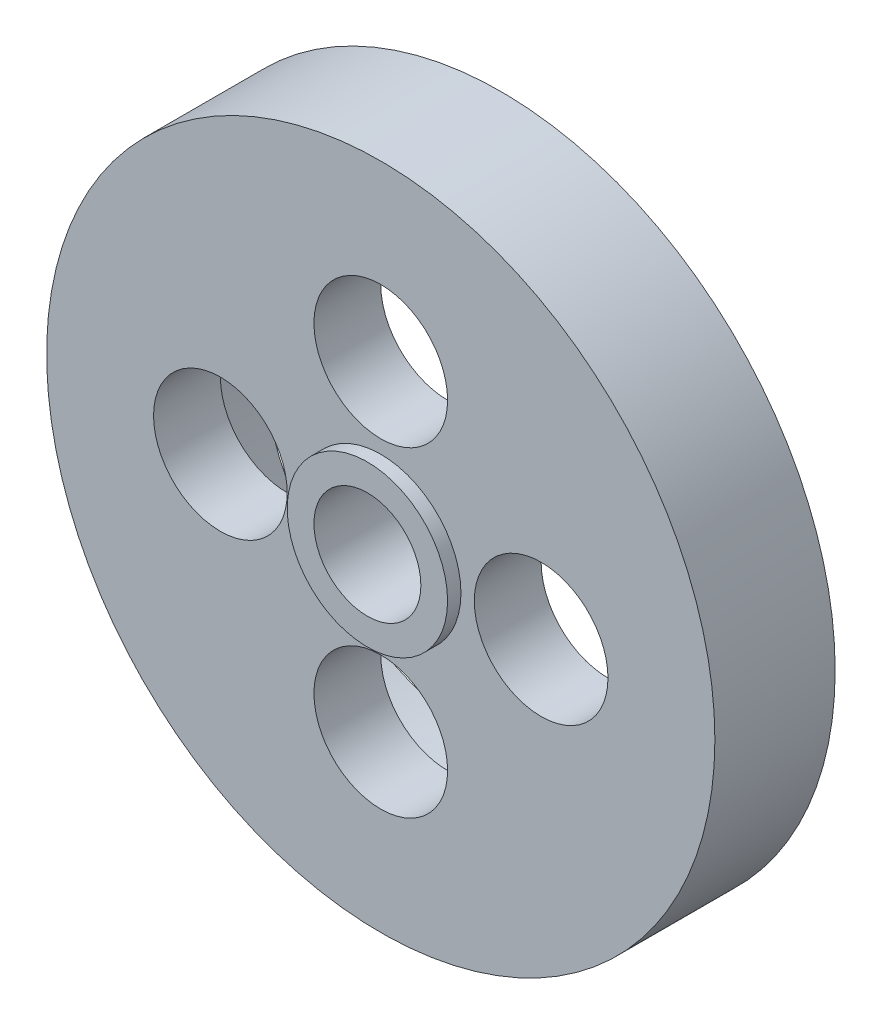
ISO-10303-21;
HEADER;
FILE_DESCRIPTION(('STEP AP214'),'2;1');
FILE_NAME('part.step','',(''),(''),'','','');
FILE_SCHEMA(('AUTOMOTIVE_DESIGN { 1 0 10303 214 1 1 1 1 }'));
ENDSEC;
DATA;
#1=APPLICATION_CONTEXT('core data for automotive mechanical design processes');
#2=APPLICATION_PROTOCOL_DEFINITION('international standard','automotive_design',2000,#1);
#3=PRODUCT_CONTEXT('',#1,'mechanical');
#4=PRODUCT('Part','Part','',(#3));
#5=PRODUCT_RELATED_PRODUCT_CATEGORY('part','',(#4));
#6=PRODUCT_DEFINITION_FORMATION('','',#4);
#7=PRODUCT_DEFINITION_CONTEXT('part definition',#1,'design');
#8=PRODUCT_DEFINITION('design','',#6,#7);
#9=PRODUCT_DEFINITION_SHAPE('','',#8);
#10=(LENGTH_UNIT() NAMED_UNIT(*) SI_UNIT(.MILLI.,.METRE.));
#11=(NAMED_UNIT(*) PLANE_ANGLE_UNIT() SI_UNIT($,.RADIAN.));
#12=(NAMED_UNIT(*) SI_UNIT($,.STERADIAN.) SOLID_ANGLE_UNIT());
#13=UNCERTAINTY_MEASURE_WITH_UNIT(LENGTH_MEASURE(1.E-05),#10,'distance_accuracy_value','');
#14=(GEOMETRIC_REPRESENTATION_CONTEXT(3) GLOBAL_UNCERTAINTY_ASSIGNED_CONTEXT((#13)) GLOBAL_UNIT_ASSIGNED_CONTEXT((#10,
#11,#12)) REPRESENTATION_CONTEXT('',''));
#15=CARTESIAN_POINT('',(0.,0.,0.));
#16=DIRECTION('',(0.,0.,1.));
#17=DIRECTION('',(1.,0.,0.));
#18=AXIS2_PLACEMENT_3D('',#15,#16,#17);
#19=CARTESIAN_POINT('',(0.,0.,9.));
#20=DIRECTION('',(0.,0.,1.));
#21=DIRECTION('',(1.,0.,0.));
#22=AXIS2_PLACEMENT_3D('',#19,#20,#21);
#23=PLANE('',#22);
#24=CARTESIAN_POINT('',(0.,0.,9.));
#25=DIRECTION('',(0.,0.,1.));
#26=DIRECTION('',(1.,0.,0.));
#27=AXIS2_PLACEMENT_3D('',#24,#25,#26);
#28=CIRCLE('',#27,25.);
#29=CARTESIAN_POINT('',(25.,0.,9.));
#30=VERTEX_POINT('',#29);
#31=EDGE_CURVE('E10',#30,#30,#28,.T.);
#32=ORIENTED_EDGE('',*,*,#31,.T.);
#33=EDGE_LOOP('',(#32));
#34=FACE_BOUND('',#33,.T.);
#35=CARTESIAN_POINT('',(12.,1.25693328198353E-13,9.));
#36=DIRECTION('',(0.,0.,1.));
#37=DIRECTION('',(1.,0.,0.));
#38=AXIS2_PLACEMENT_3D('',#35,#36,#37);
#39=CIRCLE('',#38,5.);
#40=CARTESIAN_POINT('',(17.,1.25693328198353E-13,9.));
#41=VERTEX_POINT('',#40);
#42=EDGE_CURVE('E60',#41,#41,#39,.F.);
#43=ORIENTED_EDGE('',*,*,#42,.T.);
#44=EDGE_LOOP('',(#43));
#45=FACE_BOUND('',#44,.T.);
#46=CARTESIAN_POINT('',(0.,-12.,9.));
#47=DIRECTION('',(0.,0.,1.));
#48=DIRECTION('',(1.,0.,0.));
#49=AXIS2_PLACEMENT_3D('',#46,#47,#48);
#50=CIRCLE('',#49,5.);
#51=CARTESIAN_POINT('',(5.00000000000008,-12.,9.));
#52=VERTEX_POINT('',#51);
#53=EDGE_CURVE('E64',#52,#52,#50,.F.);
#54=ORIENTED_EDGE('',*,*,#53,.T.);
#55=EDGE_LOOP('',(#54));
#56=FACE_BOUND('',#55,.T.);
#57=CARTESIAN_POINT('',(-12.,0.,9.));
#58=DIRECTION('',(0.,0.,1.));
#59=DIRECTION('',(1.,0.,0.));
#60=AXIS2_PLACEMENT_3D('',#57,#58,#59);
#61=CIRCLE('',#60,5.);
#62=CARTESIAN_POINT('',(-7.,0.,9.));
#63=VERTEX_POINT('',#62);
#64=EDGE_CURVE('E69',#63,#63,#61,.F.);
#65=ORIENTED_EDGE('',*,*,#64,.T.);
#66=EDGE_LOOP('',(#65));
#67=FACE_BOUND('',#66,.T.);
#68=CARTESIAN_POINT('',(0.,12.,9.));
#69=DIRECTION('',(0.,0.,1.));
#70=DIRECTION('',(1.,0.,0.));
#71=AXIS2_PLACEMENT_3D('',#68,#69,#70);
#72=CIRCLE('',#71,5.);
#73=CARTESIAN_POINT('',(5.,12.,9.));
#74=VERTEX_POINT('',#73);
#75=EDGE_CURVE('E58',#74,#74,#72,.F.);
#76=ORIENTED_EDGE('',*,*,#75,.T.);
#77=EDGE_LOOP('',(#76));
#78=FACE_BOUND('',#77,.T.);
#79=CARTESIAN_POINT('',(0.,0.,9.));
#80=DIRECTION('',(0.,0.,1.));
#81=DIRECTION('',(1.,0.,0.));
#82=AXIS2_PLACEMENT_3D('',#79,#80,#81);
#83=CIRCLE('',#82,6.);
#84=CARTESIAN_POINT('',(6.,0.,9.));
#85=VERTEX_POINT('',#84);
#86=EDGE_CURVE('E100',#85,#85,#83,.T.);
#87=ORIENTED_EDGE('',*,*,#86,.F.);
#88=EDGE_LOOP('',(#87));
#89=FACE_BOUND('',#88,.T.);
#90=ADVANCED_FACE('F43',(#34,#45,#56,#67,#78,#89),#23,.T.);
#91=CARTESIAN_POINT('',(12.,1.25693328198353E-13,9.001));
#92=DIRECTION('',(0.,0.,-1.));
#93=DIRECTION('',(-1.,0.,0.));
#94=AXIS2_PLACEMENT_3D('',#91,#92,#93);
#95=CYLINDRICAL_SURFACE('',#94,5.);
#96=ORIENTED_EDGE('',*,*,#42,.F.);
#97=EDGE_LOOP('',(#96));
#98=FACE_BOUND('',#97,.T.);
#99=CARTESIAN_POINT('',(12.,1.25693328198353E-13,4.));
#100=DIRECTION('',(0.,0.,-1.));
#101=DIRECTION('',(-1.,0.,0.));
#102=AXIS2_PLACEMENT_3D('',#99,#100,#101);
#103=CIRCLE('',#102,5.);
#104=CARTESIAN_POINT('',(7.,1.25693328198353E-13,4.));
#105=VERTEX_POINT('',#104);
#106=EDGE_CURVE('E65',#105,#105,#103,.F.);
#107=ORIENTED_EDGE('',*,*,#106,.F.);
#108=EDGE_LOOP('',(#107));
#109=FACE_BOUND('',#108,.T.);
#110=ADVANCED_FACE('F130',(#98,#109),#95,.F.);
#111=CARTESIAN_POINT('',(0.,-12.,9.001));
#112=DIRECTION('',(0.,0.,-1.));
#113=DIRECTION('',(-1.,0.,0.));
#114=AXIS2_PLACEMENT_3D('',#111,#112,#113);
#115=CYLINDRICAL_SURFACE('',#114,5.);
#116=ORIENTED_EDGE('',*,*,#53,.F.);
#117=EDGE_LOOP('',(#116));
#118=FACE_BOUND('',#117,.T.);
#119=CARTESIAN_POINT('',(0.,-12.,4.));
#120=DIRECTION('',(0.,0.,-1.));
#121=DIRECTION('',(-1.,0.,0.));
#122=AXIS2_PLACEMENT_3D('',#119,#120,#121);
#123=CIRCLE('',#122,5.);
#124=CARTESIAN_POINT('',(-4.99999999999992,-12.,4.));
#125=VERTEX_POINT('',#124);
#126=EDGE_CURVE('E79',#125,#125,#123,.F.);
#127=ORIENTED_EDGE('',*,*,#126,.F.);
#128=EDGE_LOOP('',(#127));
#129=FACE_BOUND('',#128,.T.);
#130=ADVANCED_FACE('F135',(#118,#129),#115,.F.);
#131=CARTESIAN_POINT('',(-12.,0.,9.001));
#132=DIRECTION('',(0.,0.,-1.));
#133=DIRECTION('',(-1.,0.,0.));
#134=AXIS2_PLACEMENT_3D('',#131,#132,#133);
#135=CYLINDRICAL_SURFACE('',#134,5.);
#136=ORIENTED_EDGE('',*,*,#64,.F.);
#137=EDGE_LOOP('',(#136));
#138=FACE_BOUND('',#137,.T.);
#139=CARTESIAN_POINT('',(-12.,0.,4.));
#140=DIRECTION('',(0.,0.,-1.));
#141=DIRECTION('',(-1.,0.,0.));
#142=AXIS2_PLACEMENT_3D('',#139,#140,#141);
#143=CIRCLE('',#142,5.);
#144=CARTESIAN_POINT('',(-17.,0.,4.));
#145=VERTEX_POINT('',#144);
#146=EDGE_CURVE('E83',#145,#145,#143,.F.);
#147=ORIENTED_EDGE('',*,*,#146,.F.);
#148=EDGE_LOOP('',(#147));
#149=FACE_BOUND('',#148,.T.);
#150=ADVANCED_FACE('F164',(#138,#149),#135,.F.);
#151=CARTESIAN_POINT('',(0.,12.,9.001));
#152=DIRECTION('',(0.,0.,-1.));
#153=DIRECTION('',(-1.,0.,0.));
#154=AXIS2_PLACEMENT_3D('',#151,#152,#153);
#155=CYLINDRICAL_SURFACE('',#154,5.);
#156=ORIENTED_EDGE('',*,*,#75,.F.);
#157=EDGE_LOOP('',(#156));
#158=FACE_BOUND('',#157,.T.);
#159=CARTESIAN_POINT('',(0.,12.,4.));
#160=DIRECTION('',(0.,0.,-1.));
#161=DIRECTION('',(-1.,0.,0.));
#162=AXIS2_PLACEMENT_3D('',#159,#160,#161);
#163=CIRCLE('',#162,5.);
#164=CARTESIAN_POINT('',(-5.,12.,4.));
#165=VERTEX_POINT('',#164);
#166=EDGE_CURVE('E87',#165,#165,#163,.F.);
#167=ORIENTED_EDGE('',*,*,#166,.F.);
#168=EDGE_LOOP('',(#167));
#169=FACE_BOUND('',#168,.T.);
#170=ADVANCED_FACE('F158',(#158,#169),#155,.F.);
#171=CARTESIAN_POINT('',(0.,0.,9.));
#172=DIRECTION('',(0.,0.,-1.));
#173=DIRECTION('',(-1.,0.,0.));
#174=AXIS2_PLACEMENT_3D('',#171,#172,#173);
#175=CYLINDRICAL_SURFACE('',#174,4.);
#176=CARTESIAN_POINT('',(0.,0.,4.));
#177=DIRECTION('',(0.,0.,-1.));
#178=DIRECTION('',(-1.,0.,0.));
#179=AXIS2_PLACEMENT_3D('',#176,#177,#178);
#180=CIRCLE('',#179,4.);
#181=CARTESIAN_POINT('',(-4.,0.,4.));
#182=VERTEX_POINT('',#181);
#183=EDGE_CURVE('E47',#182,#182,#180,.F.);
#184=ORIENTED_EDGE('',*,*,#183,.F.);
#185=EDGE_LOOP('',(#184));
#186=FACE_BOUND('',#185,.T.);
#187=CARTESIAN_POINT('',(0.,0.,10.));
#188=DIRECTION('',(0.,0.,1.));
#189=DIRECTION('',(1.,0.,0.));
#190=AXIS2_PLACEMENT_3D('',#187,#188,#189);
#191=CIRCLE('',#190,4.);
#192=CARTESIAN_POINT('',(4.,0.,10.));
#193=VERTEX_POINT('',#192);
#194=EDGE_CURVE('E104',#193,#193,#191,.T.);
#195=ORIENTED_EDGE('',*,*,#194,.T.);
#196=EDGE_LOOP('',(#195));
#197=FACE_BOUND('',#196,.T.);
#198=ADVANCED_FACE('F112',(#186,#197),#175,.F.);
#199=CARTESIAN_POINT('',(0.,0.,9.));
#200=DIRECTION('',(0.,0.,-1.));
#201=DIRECTION('',(-1.,0.,0.));
#202=AXIS2_PLACEMENT_3D('',#199,#200,#201);
#203=CYLINDRICAL_SURFACE('',#202,25.);
#204=ORIENTED_EDGE('',*,*,#31,.F.);
#205=EDGE_LOOP('',(#204));
#206=FACE_BOUND('',#205,.T.);
#207=CARTESIAN_POINT('',(0.,0.,0.));
#208=DIRECTION('',(0.,0.,1.));
#209=DIRECTION('',(1.,0.,0.));
#210=AXIS2_PLACEMENT_3D('',#207,#208,#209);
#211=CIRCLE('',#210,25.);
#212=CARTESIAN_POINT('',(25.,0.,0.));
#213=VERTEX_POINT('',#212);
#214=EDGE_CURVE('E52',#213,#213,#211,.T.);
#215=ORIENTED_EDGE('',*,*,#214,.T.);
#216=EDGE_LOOP('',(#215));
#217=FACE_BOUND('',#216,.T.);
#218=ADVANCED_FACE('F45',(#206,#217),#203,.T.);
#219=CARTESIAN_POINT('',(0.,0.,0.));
#220=DIRECTION('',(0.,0.,1.));
#221=DIRECTION('',(1.,0.,0.));
#222=AXIS2_PLACEMENT_3D('',#219,#220,#221);
#223=PLANE('',#222);
#224=CARTESIAN_POINT('',(0.,0.,0.));
#225=DIRECTION('',(0.,0.,-1.));
#226=DIRECTION('',(-1.,0.,0.));
#227=AXIS2_PLACEMENT_3D('',#224,#225,#226);
#228=CIRCLE('',#227,18.);
#229=CARTESIAN_POINT('',(-18.,0.,0.));
#230=VERTEX_POINT('',#229);
#231=EDGE_CURVE('E91',#230,#230,#228,.T.);
#232=ORIENTED_EDGE('',*,*,#231,.F.);
#233=EDGE_LOOP('',(#232));
#234=FACE_BOUND('',#233,.T.);
#235=ORIENTED_EDGE('',*,*,#214,.F.);
#236=EDGE_LOOP('',(#235));
#237=FACE_BOUND('',#236,.T.);
#238=ADVANCED_FACE('F140',(#234,#237),#223,.F.);
#239=CARTESIAN_POINT('',(0.,0.,4.));
#240=DIRECTION('',(0.,0.,-1.));
#241=DIRECTION('',(-1.,0.,0.));
#242=AXIS2_PLACEMENT_3D('',#239,#240,#241);
#243=PLANE('',#242);
#244=CARTESIAN_POINT('',(0.,0.,4.));
#245=DIRECTION('',(0.,0.,-1.));
#246=DIRECTION('',(-1.,0.,0.));
#247=AXIS2_PLACEMENT_3D('',#244,#245,#246);
#248=CIRCLE('',#247,18.);
#249=CARTESIAN_POINT('',(-18.,0.,4.));
#250=VERTEX_POINT('',#249);
#251=EDGE_CURVE('E95',#250,#250,#248,.T.);
#252=ORIENTED_EDGE('',*,*,#251,.T.);
#253=EDGE_LOOP('',(#252));
#254=FACE_BOUND('',#253,.T.);
#255=ORIENTED_EDGE('',*,*,#183,.T.);
#256=EDGE_LOOP('',(#255));
#257=FACE_BOUND('',#256,.T.);
#258=ORIENTED_EDGE('',*,*,#166,.T.);
#259=EDGE_LOOP('',(#258));
#260=FACE_BOUND('',#259,.T.);
#261=ORIENTED_EDGE('',*,*,#146,.T.);
#262=EDGE_LOOP('',(#261));
#263=FACE_BOUND('',#262,.T.);
#264=ORIENTED_EDGE('',*,*,#126,.T.);
#265=EDGE_LOOP('',(#264));
#266=FACE_BOUND('',#265,.T.);
#267=ORIENTED_EDGE('',*,*,#106,.T.);
#268=EDGE_LOOP('',(#267));
#269=FACE_BOUND('',#268,.T.);
#270=ADVANCED_FACE('F126',(#254,#257,#260,#263,#266,#269),#243,.T.);
#271=CARTESIAN_POINT('',(0.,0.,4.));
#272=DIRECTION('',(0.,0.,-1.));
#273=DIRECTION('',(-1.,0.,0.));
#274=AXIS2_PLACEMENT_3D('',#271,#272,#273);
#275=CYLINDRICAL_SURFACE('',#274,18.);
#276=ORIENTED_EDGE('',*,*,#251,.F.);
#277=EDGE_LOOP('',(#276));
#278=FACE_BOUND('',#277,.T.);
#279=ORIENTED_EDGE('',*,*,#231,.T.);
#280=EDGE_LOOP('',(#279));
#281=FACE_BOUND('',#280,.T.);
#282=ADVANCED_FACE('F117',(#278,#281),#275,.F.);
#283=CARTESIAN_POINT('',(0.,0.,10.));
#284=DIRECTION('',(0.,0.,1.));
#285=DIRECTION('',(1.,0.,0.));
#286=AXIS2_PLACEMENT_3D('',#283,#284,#285);
#287=PLANE('',#286);
#288=CARTESIAN_POINT('',(0.,0.,10.));
#289=DIRECTION('',(0.,0.,1.));
#290=DIRECTION('',(1.,0.,0.));
#291=AXIS2_PLACEMENT_3D('',#288,#289,#290);
#292=CIRCLE('',#291,6.);
#293=CARTESIAN_POINT('',(6.,0.,10.));
#294=VERTEX_POINT('',#293);
#295=EDGE_CURVE('E96',#294,#294,#292,.T.);
#296=ORIENTED_EDGE('',*,*,#295,.T.);
#297=EDGE_LOOP('',(#296));
#298=FACE_BOUND('',#297,.T.);
#299=ORIENTED_EDGE('',*,*,#194,.F.);
#300=EDGE_LOOP('',(#299));
#301=FACE_BOUND('',#300,.T.);
#302=ADVANCED_FACE('F114',(#298,#301),#287,.T.);
#303=CARTESIAN_POINT('',(0.,0.,10.));
#304=DIRECTION('',(0.,0.,-1.));
#305=DIRECTION('',(-1.,0.,0.));
#306=AXIS2_PLACEMENT_3D('',#303,#304,#305);
#307=CYLINDRICAL_SURFACE('',#306,6.);
#308=ORIENTED_EDGE('',*,*,#295,.F.);
#309=EDGE_LOOP('',(#308));
#310=FACE_BOUND('',#309,.T.);
#311=ORIENTED_EDGE('',*,*,#86,.T.);
#312=EDGE_LOOP('',(#311));
#313=FACE_BOUND('',#312,.T.);
#314=ADVANCED_FACE('F116',(#310,#313),#307,.T.);
#315=CLOSED_SHELL('',(#90,#110,#130,#150,#170,#198,#218,#238,#270,#282,#302,#314));
#316=MANIFOLD_SOLID_BREP('B2',#315);
#317=ADVANCED_BREP_SHAPE_REPRESENTATION('',(#18,#316),#14);
#318=SHAPE_DEFINITION_REPRESENTATION(#9,#317);
ENDSEC;
END-ISO-10303-21;
